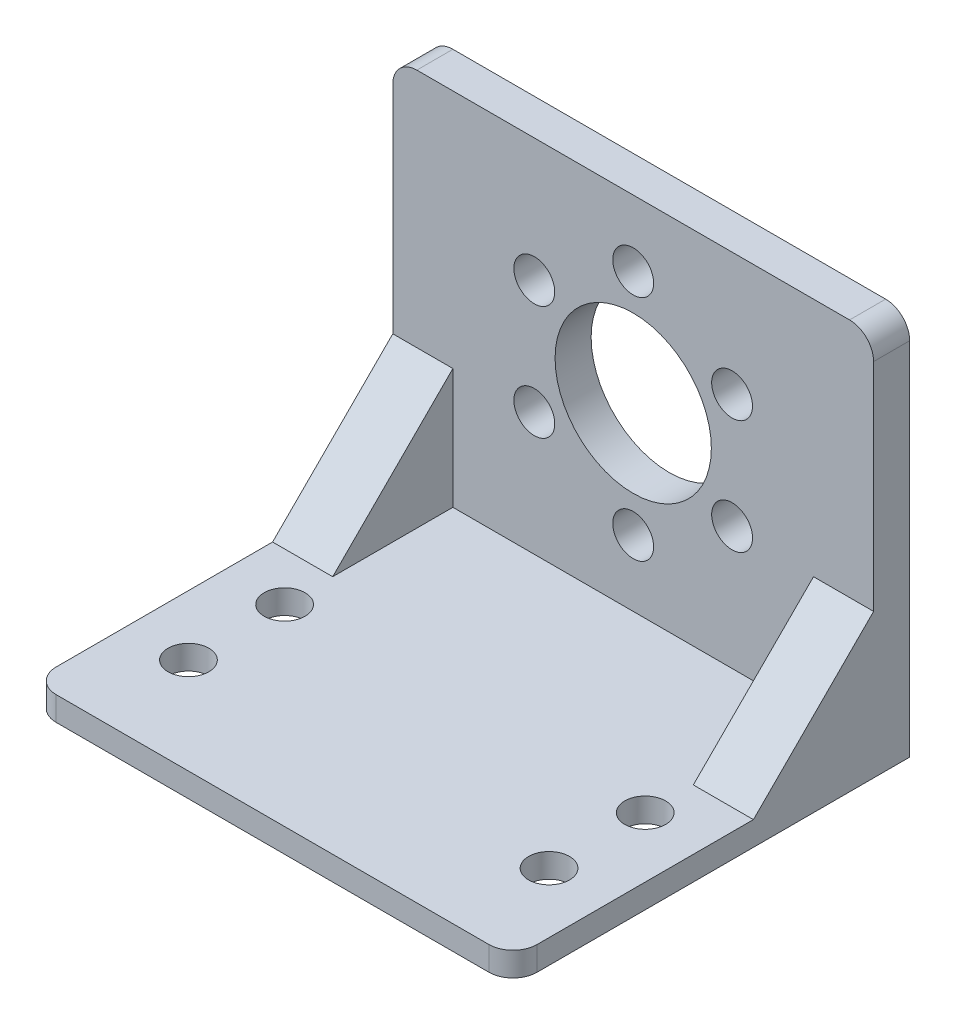
ISO-10303-21;
HEADER;
FILE_DESCRIPTION(('STEP AP214'),'2;1');
FILE_NAME('part.step','',(''),(''),'','','');
FILE_SCHEMA(('AUTOMOTIVE_DESIGN { 1 0 10303 214 1 1 1 1 }'));
ENDSEC;
DATA;
#1=APPLICATION_CONTEXT('core data for automotive mechanical design processes');
#2=APPLICATION_PROTOCOL_DEFINITION('international standard','automotive_design',2000,#1);
#3=PRODUCT_CONTEXT('',#1,'mechanical');
#4=PRODUCT('Part','Part','',(#3));
#5=PRODUCT_RELATED_PRODUCT_CATEGORY('part','',(#4));
#6=PRODUCT_DEFINITION_FORMATION('','',#4);
#7=PRODUCT_DEFINITION_CONTEXT('part definition',#1,'design');
#8=PRODUCT_DEFINITION('design','',#6,#7);
#9=PRODUCT_DEFINITION_SHAPE('','',#8);
#10=(LENGTH_UNIT() NAMED_UNIT(*) SI_UNIT(.MILLI.,.METRE.));
#11=(NAMED_UNIT(*) PLANE_ANGLE_UNIT() SI_UNIT($,.RADIAN.));
#12=(NAMED_UNIT(*) SI_UNIT($,.STERADIAN.) SOLID_ANGLE_UNIT());
#13=UNCERTAINTY_MEASURE_WITH_UNIT(LENGTH_MEASURE(1.E-05),#10,'distance_accuracy_value','');
#14=(GEOMETRIC_REPRESENTATION_CONTEXT(3) GLOBAL_UNCERTAINTY_ASSIGNED_CONTEXT((#13)) GLOBAL_UNIT_ASSIGNED_CONTEXT((#10,
#11,#12)) REPRESENTATION_CONTEXT('',''));
#15=CARTESIAN_POINT('',(0.,0.,0.));
#16=DIRECTION('',(0.,0.,1.));
#17=DIRECTION('',(1.,0.,0.));
#18=AXIS2_PLACEMENT_3D('',#15,#16,#17);
#19=CARTESIAN_POINT('',(0.,0.,3.));
#20=DIRECTION('',(0.,0.,1.));
#21=DIRECTION('',(1.,0.,0.));
#22=AXIS2_PLACEMENT_3D('',#19,#20,#21);
#23=PLANE('',#22);
#24=CARTESIAN_POINT('',(0.,17.,3.));
#25=DIRECTION('',(0.,0.,1.));
#26=DIRECTION('',(1.,0.,0.));
#27=AXIS2_PLACEMENT_3D('',#24,#25,#26);
#28=CIRCLE('',#27,6.5);
#29=CARTESIAN_POINT('',(6.5,17.,3.));
#30=VERTEX_POINT('',#29);
#31=EDGE_CURVE('E194',#30,#30,#28,.T.);
#32=ORIENTED_EDGE('',*,*,#31,.F.);
#33=EDGE_LOOP('',(#32));
#34=FACE_BOUND('',#33,.T.);
#35=CARTESIAN_POINT('',(-8.22724133595218,12.25,3.));
#36=DIRECTION('',(0.,0.,1.));
#37=DIRECTION('',(1.,0.,0.));
#38=AXIS2_PLACEMENT_3D('',#35,#36,#37);
#39=CIRCLE('',#38,1.7);
#40=CARTESIAN_POINT('',(-6.52724133595218,12.25,3.));
#41=VERTEX_POINT('',#40);
#42=EDGE_CURVE('E207',#41,#41,#39,.T.);
#43=ORIENTED_EDGE('',*,*,#42,.F.);
#44=EDGE_LOOP('',(#43));
#45=FACE_BOUND('',#44,.T.);
#46=CARTESIAN_POINT('',(8.22724133595218,12.25,3.));
#47=DIRECTION('',(0.,0.,1.));
#48=DIRECTION('',(1.,0.,0.));
#49=AXIS2_PLACEMENT_3D('',#46,#47,#48);
#50=CIRCLE('',#49,1.7);
#51=CARTESIAN_POINT('',(9.92724133595218,12.25,3.));
#52=VERTEX_POINT('',#51);
#53=EDGE_CURVE('E219',#52,#52,#50,.T.);
#54=ORIENTED_EDGE('',*,*,#53,.F.);
#55=EDGE_LOOP('',(#54));
#56=FACE_BOUND('',#55,.T.);
#57=CARTESIAN_POINT('',(0.,26.5,3.));
#58=DIRECTION('',(0.,0.,1.));
#59=DIRECTION('',(1.,0.,0.));
#60=AXIS2_PLACEMENT_3D('',#57,#58,#59);
#61=CIRCLE('',#60,1.7);
#62=CARTESIAN_POINT('',(1.7,26.5,3.));
#63=VERTEX_POINT('',#62);
#64=EDGE_CURVE('E231',#63,#63,#61,.T.);
#65=ORIENTED_EDGE('',*,*,#64,.F.);
#66=EDGE_LOOP('',(#65));
#67=FACE_BOUND('',#66,.T.);
#68=CARTESIAN_POINT('',(8.22724133595218,21.75,3.));
#69=DIRECTION('',(0.,0.,1.));
#70=DIRECTION('',(1.,0.,0.));
#71=AXIS2_PLACEMENT_3D('',#68,#69,#70);
#72=CIRCLE('',#71,1.7);
#73=CARTESIAN_POINT('',(9.92724133595218,21.75,3.));
#74=VERTEX_POINT('',#73);
#75=EDGE_CURVE('E225',#74,#74,#72,.T.);
#76=ORIENTED_EDGE('',*,*,#75,.F.);
#77=EDGE_LOOP('',(#76));
#78=FACE_BOUND('',#77,.T.);
#79=CARTESIAN_POINT('',(0.,7.49999999999999,3.));
#80=DIRECTION('',(0.,0.,1.));
#81=DIRECTION('',(1.,0.,0.));
#82=AXIS2_PLACEMENT_3D('',#79,#80,#81);
#83=CIRCLE('',#82,1.7);
#84=CARTESIAN_POINT('',(1.7,7.49999999999999,3.));
#85=VERTEX_POINT('',#84);
#86=EDGE_CURVE('E213',#85,#85,#83,.T.);
#87=ORIENTED_EDGE('',*,*,#86,.F.);
#88=EDGE_LOOP('',(#87));
#89=FACE_BOUND('',#88,.T.);
#90=CARTESIAN_POINT('',(-8.22724133595218,21.75,3.));
#91=DIRECTION('',(0.,0.,1.));
#92=DIRECTION('',(1.,0.,0.));
#93=AXIS2_PLACEMENT_3D('',#90,#91,#92);
#94=CIRCLE('',#93,1.7);
#95=CARTESIAN_POINT('',(-6.52724133595218,21.75,3.));
#96=VERTEX_POINT('',#95);
#97=EDGE_CURVE('E201',#96,#96,#94,.T.);
#98=ORIENTED_EDGE('',*,*,#97,.F.);
#99=EDGE_LOOP('',(#98));
#100=FACE_BOUND('',#99,.T.);
#101=DIRECTION('',(-1.,0.,0.));
#102=VECTOR('',#101,1.);
#103=CARTESIAN_POINT('',(20.,32.,3.));
#104=LINE('',#103,#102);
#105=CARTESIAN_POINT('',(18.,32.,3.));
#106=VERTEX_POINT('',#105);
#107=CARTESIAN_POINT('',(-18.,32.,3.));
#108=VERTEX_POINT('',#107);
#109=EDGE_CURVE('E239',#106,#108,#104,.T.);
#110=ORIENTED_EDGE('',*,*,#109,.T.);
#111=CARTESIAN_POINT('',(-18.,30.,3.));
#112=DIRECTION('',(0.,0.,1.));
#113=DIRECTION('',(1.,0.,0.));
#114=AXIS2_PLACEMENT_3D('',#111,#112,#113);
#115=CIRCLE('',#114,2.);
#116=CARTESIAN_POINT('',(-20.,30.,3.));
#117=VERTEX_POINT('',#116);
#118=EDGE_CURVE('E11',#108,#117,#115,.T.);
#119=ORIENTED_EDGE('',*,*,#118,.T.);
#120=DIRECTION('',(0.,-1.,0.));
#121=VECTOR('',#120,1.);
#122=CARTESIAN_POINT('',(-20.,0.,3.));
#123=LINE('',#122,#121);
#124=CARTESIAN_POINT('',(-20.,12.,3.));
#125=VERTEX_POINT('',#124);
#126=EDGE_CURVE('E242',#117,#125,#123,.T.);
#127=ORIENTED_EDGE('',*,*,#126,.T.);
#128=DIRECTION('',(-1.,0.,0.));
#129=VECTOR('',#128,1.);
#130=CARTESIAN_POINT('',(-15.,12.,3.));
#131=LINE('',#130,#129);
#132=CARTESIAN_POINT('',(-15.,12.,3.));
#133=VERTEX_POINT('',#132);
#134=EDGE_CURVE('E161',#133,#125,#131,.T.);
#135=ORIENTED_EDGE('',*,*,#134,.F.);
#136=DIRECTION('',(0.,-1.,0.));
#137=VECTOR('',#136,1.);
#138=CARTESIAN_POINT('',(-15.,1.99999999999999,3.));
#139=LINE('',#138,#137);
#140=CARTESIAN_POINT('',(-15.,1.99999999999999,3.));
#141=VERTEX_POINT('',#140);
#142=EDGE_CURVE('E166',#133,#141,#139,.T.);
#143=ORIENTED_EDGE('',*,*,#142,.T.);
#144=DIRECTION('',(-1.,0.,0.));
#145=VECTOR('',#144,1.);
#146=CARTESIAN_POINT('',(-20.,1.99999999999999,3.));
#147=LINE('',#146,#145);
#148=CARTESIAN_POINT('',(15.,2.,3.));
#149=VERTEX_POINT('',#148);
#150=EDGE_CURVE('E150',#149,#141,#147,.T.);
#151=ORIENTED_EDGE('',*,*,#150,.F.);
#152=DIRECTION('',(0.,-1.,0.));
#153=VECTOR('',#152,1.);
#154=CARTESIAN_POINT('',(15.,1.99999999999999,3.));
#155=LINE('',#154,#153);
#156=CARTESIAN_POINT('',(15.,12.,3.));
#157=VERTEX_POINT('',#156);
#158=EDGE_CURVE('E304',#157,#149,#155,.T.);
#159=ORIENTED_EDGE('',*,*,#158,.F.);
#160=DIRECTION('',(1.,0.,0.));
#161=VECTOR('',#160,1.);
#162=CARTESIAN_POINT('',(15.,12.,3.));
#163=LINE('',#162,#161);
#164=CARTESIAN_POINT('',(20.,12.,3.));
#165=VERTEX_POINT('',#164);
#166=EDGE_CURVE('E178',#157,#165,#163,.T.);
#167=ORIENTED_EDGE('',*,*,#166,.T.);
#168=DIRECTION('',(0.,1.,0.));
#169=VECTOR('',#168,1.);
#170=CARTESIAN_POINT('',(20.,0.,3.));
#171=LINE('',#170,#169);
#172=CARTESIAN_POINT('',(20.,30.,3.));
#173=VERTEX_POINT('',#172);
#174=EDGE_CURVE('E237',#165,#173,#171,.T.);
#175=ORIENTED_EDGE('',*,*,#174,.T.);
#176=CARTESIAN_POINT('',(18.,30.,3.));
#177=DIRECTION('',(0.,0.,1.));
#178=DIRECTION('',(1.,0.,0.));
#179=AXIS2_PLACEMENT_3D('',#176,#177,#178);
#180=CIRCLE('',#179,2.);
#181=EDGE_CURVE('E56',#173,#106,#180,.T.);
#182=ORIENTED_EDGE('',*,*,#181,.T.);
#183=EDGE_LOOP('',(#110,#119,#127,#135,#143,#151,#159,#167,#175,#182));
#184=FACE_BOUND('',#183,.T.);
#185=ADVANCED_FACE('F47',(#34,#45,#56,#67,#78,#89,#100,#184),#23,.T.);
#186=CARTESIAN_POINT('',(-20.,1.99999999999999,33.));
#187=DIRECTION('',(0.,-1.,0.));
#188=DIRECTION('',(1.,0.,0.));
#189=AXIS2_PLACEMENT_3D('',#186,#187,#188);
#190=PLANE('',#189);
#191=CARTESIAN_POINT('',(15.,2.,17.));
#192=DIRECTION('',(0.,1.,0.));
#193=DIRECTION('',(0.,0.,1.));
#194=AXIS2_PLACEMENT_3D('',#191,#192,#193);
#195=CIRCLE('',#194,1.7);
#196=CARTESIAN_POINT('',(15.,2.,18.7));
#197=VERTEX_POINT('',#196);
#198=EDGE_CURVE('E321',#197,#197,#195,.T.);
#199=ORIENTED_EDGE('',*,*,#198,.F.);
#200=EDGE_LOOP('',(#199));
#201=FACE_BOUND('',#200,.T.);
#202=CARTESIAN_POINT('',(-15.,2.,25.));
#203=DIRECTION('',(0.,1.,0.));
#204=DIRECTION('',(0.,0.,1.));
#205=AXIS2_PLACEMENT_3D('',#202,#203,#204);
#206=CIRCLE('',#205,1.7);
#207=CARTESIAN_POINT('',(-15.,2.,26.7));
#208=VERTEX_POINT('',#207);
#209=EDGE_CURVE('E322',#208,#208,#206,.T.);
#210=ORIENTED_EDGE('',*,*,#209,.F.);
#211=EDGE_LOOP('',(#210));
#212=FACE_BOUND('',#211,.T.);
#213=CARTESIAN_POINT('',(15.,2.,25.));
#214=DIRECTION('',(0.,1.,0.));
#215=DIRECTION('',(0.,0.,1.));
#216=AXIS2_PLACEMENT_3D('',#213,#214,#215);
#217=CIRCLE('',#216,1.7);
#218=CARTESIAN_POINT('',(15.,2.,26.7));
#219=VERTEX_POINT('',#218);
#220=EDGE_CURVE('E325',#219,#219,#217,.T.);
#221=ORIENTED_EDGE('',*,*,#220,.F.);
#222=EDGE_LOOP('',(#221));
#223=FACE_BOUND('',#222,.T.);
#224=CARTESIAN_POINT('',(-15.,2.,17.));
#225=DIRECTION('',(0.,1.,0.));
#226=DIRECTION('',(0.,0.,1.));
#227=AXIS2_PLACEMENT_3D('',#224,#225,#226);
#228=CIRCLE('',#227,1.7);
#229=CARTESIAN_POINT('',(-15.,2.,18.7));
#230=VERTEX_POINT('',#229);
#231=EDGE_CURVE('E293',#230,#230,#228,.T.);
#232=ORIENTED_EDGE('',*,*,#231,.F.);
#233=EDGE_LOOP('',(#232));
#234=FACE_BOUND('',#233,.T.);
#235=DIRECTION('',(-1.,0.,0.));
#236=VECTOR('',#235,1.);
#237=CARTESIAN_POINT('',(-20.,1.99999999999999,33.));
#238=LINE('',#237,#236);
#239=CARTESIAN_POINT('',(18.,2.,33.));
#240=VERTEX_POINT('',#239);
#241=CARTESIAN_POINT('',(-18.,1.99999999999999,33.));
#242=VERTEX_POINT('',#241);
#243=EDGE_CURVE('E187',#240,#242,#238,.T.);
#244=ORIENTED_EDGE('',*,*,#243,.F.);
#245=CARTESIAN_POINT('',(18.,2.,31.));
#246=DIRECTION('',(0.,-1.,0.));
#247=DIRECTION('',(1.,0.,0.));
#248=AXIS2_PLACEMENT_3D('',#245,#246,#247);
#249=CIRCLE('',#248,2.);
#250=CARTESIAN_POINT('',(20.,2.,31.));
#251=VERTEX_POINT('',#250);
#252=EDGE_CURVE('E265',#240,#251,#249,.F.);
#253=ORIENTED_EDGE('',*,*,#252,.T.);
#254=DIRECTION('',(0.,0.,-1.));
#255=VECTOR('',#254,1.);
#256=CARTESIAN_POINT('',(20.,2.,33.));
#257=LINE('',#256,#255);
#258=CARTESIAN_POINT('',(20.,2.,13.));
#259=VERTEX_POINT('',#258);
#260=EDGE_CURVE('E192',#251,#259,#257,.T.);
#261=ORIENTED_EDGE('',*,*,#260,.T.);
#262=DIRECTION('',(1.,0.,0.));
#263=VECTOR('',#262,1.);
#264=CARTESIAN_POINT('',(15.,2.,13.));
#265=LINE('',#264,#263);
#266=CARTESIAN_POINT('',(15.,2.,13.));
#267=VERTEX_POINT('',#266);
#268=EDGE_CURVE('E175',#267,#259,#265,.T.);
#269=ORIENTED_EDGE('',*,*,#268,.F.);
#270=DIRECTION('',(0.,0.,1.));
#271=VECTOR('',#270,1.);
#272=CARTESIAN_POINT('',(15.,2.,13.));
#273=LINE('',#272,#271);
#274=EDGE_CURVE('E157',#149,#267,#273,.T.);
#275=ORIENTED_EDGE('',*,*,#274,.F.);
#276=ORIENTED_EDGE('',*,*,#150,.T.);
#277=DIRECTION('',(0.,0.,1.));
#278=VECTOR('',#277,1.);
#279=CARTESIAN_POINT('',(-15.,2.,13.));
#280=LINE('',#279,#278);
#281=CARTESIAN_POINT('',(-15.,2.,13.));
#282=VERTEX_POINT('',#281);
#283=EDGE_CURVE('E155',#141,#282,#280,.T.);
#284=ORIENTED_EDGE('',*,*,#283,.T.);
#285=DIRECTION('',(-1.,0.,0.));
#286=VECTOR('',#285,1.);
#287=CARTESIAN_POINT('',(-15.,2.,13.));
#288=LINE('',#287,#286);
#289=CARTESIAN_POINT('',(-20.,2.,13.));
#290=VERTEX_POINT('',#289);
#291=EDGE_CURVE('E181',#282,#290,#288,.T.);
#292=ORIENTED_EDGE('',*,*,#291,.T.);
#293=DIRECTION('',(0.,0.,-1.));
#294=VECTOR('',#293,1.);
#295=CARTESIAN_POINT('',(-20.,1.99999999999999,33.));
#296=LINE('',#295,#294);
#297=CARTESIAN_POINT('',(-20.,1.99999999999999,31.));
#298=VERTEX_POINT('',#297);
#299=EDGE_CURVE('E189',#298,#290,#296,.T.);
#300=ORIENTED_EDGE('',*,*,#299,.F.);
#301=CARTESIAN_POINT('',(-18.,1.99999999999999,31.));
#302=DIRECTION('',(0.,-1.,0.));
#303=DIRECTION('',(1.,0.,0.));
#304=AXIS2_PLACEMENT_3D('',#301,#302,#303);
#305=CIRCLE('',#304,2.);
#306=EDGE_CURVE('E263',#298,#242,#305,.F.);
#307=ORIENTED_EDGE('',*,*,#306,.T.);
#308=EDGE_LOOP('',(#244,#253,#261,#269,#275,#276,#284,#292,#300,#307));
#309=FACE_BOUND('',#308,.T.);
#310=ADVANCED_FACE('F153',(#201,#212,#223,#234,#309),#190,.F.);
#311=CARTESIAN_POINT('',(0.,0.,0.));
#312=DIRECTION('',(0.,0.,1.));
#313=DIRECTION('',(1.,0.,0.));
#314=AXIS2_PLACEMENT_3D('',#311,#312,#313);
#315=PLANE('',#314);
#316=CARTESIAN_POINT('',(0.,17.,0.));
#317=DIRECTION('',(0.,0.,1.));
#318=DIRECTION('',(1.,0.,0.));
#319=AXIS2_PLACEMENT_3D('',#316,#317,#318);
#320=CIRCLE('',#319,6.5);
#321=CARTESIAN_POINT('',(6.5,17.,0.));
#322=VERTEX_POINT('',#321);
#323=EDGE_CURVE('E197',#322,#322,#320,.F.);
#324=ORIENTED_EDGE('',*,*,#323,.F.);
#325=EDGE_LOOP('',(#324));
#326=FACE_BOUND('',#325,.T.);
#327=DIRECTION('',(0.,-1.,0.));
#328=VECTOR('',#327,1.);
#329=CARTESIAN_POINT('',(-20.,0.,0.));
#330=LINE('',#329,#328);
#331=CARTESIAN_POINT('',(-20.,30.,0.));
#332=VERTEX_POINT('',#331);
#333=CARTESIAN_POINT('',(-20.,0.,0.));
#334=VERTEX_POINT('',#333);
#335=EDGE_CURVE('E249',#332,#334,#330,.T.);
#336=ORIENTED_EDGE('',*,*,#335,.F.);
#337=CARTESIAN_POINT('',(-18.,30.,0.));
#338=DIRECTION('',(0.,0.,1.));
#339=DIRECTION('',(1.,0.,0.));
#340=AXIS2_PLACEMENT_3D('',#337,#338,#339);
#341=CIRCLE('',#340,2.);
#342=CARTESIAN_POINT('',(-18.,32.,0.));
#343=VERTEX_POINT('',#342);
#344=EDGE_CURVE('E282',#332,#343,#341,.F.);
#345=ORIENTED_EDGE('',*,*,#344,.T.);
#346=DIRECTION('',(-1.,0.,0.));
#347=VECTOR('',#346,1.);
#348=CARTESIAN_POINT('',(20.,32.,0.));
#349=LINE('',#348,#347);
#350=CARTESIAN_POINT('',(18.,32.,0.));
#351=VERTEX_POINT('',#350);
#352=EDGE_CURVE('E247',#351,#343,#349,.T.);
#353=ORIENTED_EDGE('',*,*,#352,.F.);
#354=CARTESIAN_POINT('',(18.,30.,0.));
#355=DIRECTION('',(0.,0.,1.));
#356=DIRECTION('',(1.,0.,0.));
#357=AXIS2_PLACEMENT_3D('',#354,#355,#356);
#358=CIRCLE('',#357,2.);
#359=CARTESIAN_POINT('',(20.,30.,0.));
#360=VERTEX_POINT('',#359);
#361=EDGE_CURVE('E280',#351,#360,#358,.F.);
#362=ORIENTED_EDGE('',*,*,#361,.T.);
#363=DIRECTION('',(0.,1.,0.));
#364=VECTOR('',#363,1.);
#365=CARTESIAN_POINT('',(20.,0.,0.));
#366=LINE('',#365,#364);
#367=CARTESIAN_POINT('',(20.,0.,0.));
#368=VERTEX_POINT('',#367);
#369=EDGE_CURVE('E234',#368,#360,#366,.T.);
#370=ORIENTED_EDGE('',*,*,#369,.F.);
#371=DIRECTION('',(1.,0.,0.));
#372=VECTOR('',#371,1.);
#373=CARTESIAN_POINT('',(20.,0.,0.));
#374=LINE('',#373,#372);
#375=EDGE_CURVE('E240',#334,#368,#374,.T.);
#376=ORIENTED_EDGE('',*,*,#375,.F.);
#377=EDGE_LOOP('',(#336,#345,#353,#362,#370,#376));
#378=FACE_BOUND('',#377,.T.);
#379=CARTESIAN_POINT('',(0.,26.5,0.));
#380=DIRECTION('',(0.,0.,1.));
#381=DIRECTION('',(1.,0.,0.));
#382=AXIS2_PLACEMENT_3D('',#379,#380,#381);
#383=CIRCLE('',#382,1.7);
#384=CARTESIAN_POINT('',(1.7,26.5,0.));
#385=VERTEX_POINT('',#384);
#386=EDGE_CURVE('E228',#385,#385,#383,.T.);
#387=ORIENTED_EDGE('',*,*,#386,.T.);
#388=EDGE_LOOP('',(#387));
#389=FACE_BOUND('',#388,.T.);
#390=CARTESIAN_POINT('',(8.22724133595218,21.75,0.));
#391=DIRECTION('',(0.,0.,1.));
#392=DIRECTION('',(1.,0.,0.));
#393=AXIS2_PLACEMENT_3D('',#390,#391,#392);
#394=CIRCLE('',#393,1.7);
#395=CARTESIAN_POINT('',(9.92724133595218,21.75,0.));
#396=VERTEX_POINT('',#395);
#397=EDGE_CURVE('E222',#396,#396,#394,.T.);
#398=ORIENTED_EDGE('',*,*,#397,.T.);
#399=EDGE_LOOP('',(#398));
#400=FACE_BOUND('',#399,.T.);
#401=CARTESIAN_POINT('',(8.22724133595218,12.25,0.));
#402=DIRECTION('',(0.,0.,1.));
#403=DIRECTION('',(1.,0.,0.));
#404=AXIS2_PLACEMENT_3D('',#401,#402,#403);
#405=CIRCLE('',#404,1.7);
#406=CARTESIAN_POINT('',(9.92724133595218,12.25,0.));
#407=VERTEX_POINT('',#406);
#408=EDGE_CURVE('E216',#407,#407,#405,.T.);
#409=ORIENTED_EDGE('',*,*,#408,.T.);
#410=EDGE_LOOP('',(#409));
#411=FACE_BOUND('',#410,.T.);
#412=CARTESIAN_POINT('',(0.,7.49999999999999,0.));
#413=DIRECTION('',(0.,0.,1.));
#414=DIRECTION('',(1.,0.,0.));
#415=AXIS2_PLACEMENT_3D('',#412,#413,#414);
#416=CIRCLE('',#415,1.7);
#417=CARTESIAN_POINT('',(1.7,7.49999999999999,0.));
#418=VERTEX_POINT('',#417);
#419=EDGE_CURVE('E210',#418,#418,#416,.T.);
#420=ORIENTED_EDGE('',*,*,#419,.T.);
#421=EDGE_LOOP('',(#420));
#422=FACE_BOUND('',#421,.T.);
#423=CARTESIAN_POINT('',(-8.22724133595218,12.25,0.));
#424=DIRECTION('',(0.,0.,1.));
#425=DIRECTION('',(1.,0.,0.));
#426=AXIS2_PLACEMENT_3D('',#423,#424,#425);
#427=CIRCLE('',#426,1.7);
#428=CARTESIAN_POINT('',(-6.52724133595218,12.25,0.));
#429=VERTEX_POINT('',#428);
#430=EDGE_CURVE('E204',#429,#429,#427,.T.);
#431=ORIENTED_EDGE('',*,*,#430,.T.);
#432=EDGE_LOOP('',(#431));
#433=FACE_BOUND('',#432,.T.);
#434=CARTESIAN_POINT('',(-8.22724133595218,21.75,0.));
#435=DIRECTION('',(0.,0.,1.));
#436=DIRECTION('',(1.,0.,0.));
#437=AXIS2_PLACEMENT_3D('',#434,#435,#436);
#438=CIRCLE('',#437,1.7);
#439=CARTESIAN_POINT('',(-6.52724133595218,21.75,0.));
#440=VERTEX_POINT('',#439);
#441=EDGE_CURVE('E200',#440,#440,#438,.T.);
#442=ORIENTED_EDGE('',*,*,#441,.T.);
#443=EDGE_LOOP('',(#442));
#444=FACE_BOUND('',#443,.T.);
#445=ADVANCED_FACE('F336',(#326,#378,#389,#400,#411,#422,#433,#444),#315,.F.);
#446=CARTESIAN_POINT('',(20.,0.,3.));
#447=DIRECTION('',(-1.,0.,0.));
#448=DIRECTION('',(0.,0.,1.));
#449=AXIS2_PLACEMENT_3D('',#446,#447,#448);
#450=PLANE('',#449);
#451=ORIENTED_EDGE('',*,*,#260,.F.);
#452=DIRECTION('',(0.,1.,0.));
#453=VECTOR('',#452,1.);
#454=CARTESIAN_POINT('',(20.,0.,31.));
#455=LINE('',#454,#453);
#456=CARTESIAN_POINT('',(20.,0.,31.));
#457=VERTEX_POINT('',#456);
#458=EDGE_CURVE('E269',#251,#457,#455,.F.);
#459=ORIENTED_EDGE('',*,*,#458,.T.);
#460=DIRECTION('',(0.,0.,-1.));
#461=VECTOR('',#460,1.);
#462=CARTESIAN_POINT('',(20.,0.,3.));
#463=LINE('',#462,#461);
#464=EDGE_CURVE('E244',#457,#368,#463,.T.);
#465=ORIENTED_EDGE('',*,*,#464,.T.);
#466=ORIENTED_EDGE('',*,*,#369,.T.);
#467=DIRECTION('',(0.,0.,-1.));
#468=VECTOR('',#467,1.);
#469=CARTESIAN_POINT('',(20.,30.,3.));
#470=LINE('',#469,#468);
#471=EDGE_CURVE('E267',#360,#173,#470,.F.);
#472=ORIENTED_EDGE('',*,*,#471,.T.);
#473=ORIENTED_EDGE('',*,*,#174,.F.);
#474=DIRECTION('',(0.,0.707106781186547,-0.707106781186548));
#475=VECTOR('',#474,1.);
#476=CARTESIAN_POINT('',(20.,12.,3.));
#477=LINE('',#476,#475);
#478=EDGE_CURVE('E300',#259,#165,#477,.T.);
#479=ORIENTED_EDGE('',*,*,#478,.F.);
#480=EDGE_LOOP('',(#451,#459,#465,#466,#472,#473,#479));
#481=FACE_BOUND('',#480,.T.);
#482=ADVANCED_FACE('F381',(#481),#450,.F.);
#483=CARTESIAN_POINT('',(20.,32.,3.));
#484=DIRECTION('',(0.,-1.,0.));
#485=DIRECTION('',(0.,0.,-1.));
#486=AXIS2_PLACEMENT_3D('',#483,#484,#485);
#487=PLANE('',#486);
#488=ORIENTED_EDGE('',*,*,#352,.T.);
#489=DIRECTION('',(0.,0.,-1.));
#490=VECTOR('',#489,1.);
#491=CARTESIAN_POINT('',(-18.,32.,3.));
#492=LINE('',#491,#490);
#493=EDGE_CURVE('E64',#343,#108,#492,.F.);
#494=ORIENTED_EDGE('',*,*,#493,.T.);
#495=ORIENTED_EDGE('',*,*,#109,.F.);
#496=DIRECTION('',(0.,0.,-1.));
#497=VECTOR('',#496,1.);
#498=CARTESIAN_POINT('',(18.,32.,3.));
#499=LINE('',#498,#497);
#500=EDGE_CURVE('E284',#106,#351,#499,.T.);
#501=ORIENTED_EDGE('',*,*,#500,.T.);
#502=EDGE_LOOP('',(#488,#494,#495,#501));
#503=FACE_BOUND('',#502,.T.);
#504=ADVANCED_FACE('F384',(#503),#487,.F.);
#505=CARTESIAN_POINT('',(-20.,0.,3.));
#506=DIRECTION('',(1.,0.,0.));
#507=DIRECTION('',(0.,0.,-1.));
#508=AXIS2_PLACEMENT_3D('',#505,#506,#507);
#509=PLANE('',#508);
#510=DIRECTION('',(0.,0.,-1.));
#511=VECTOR('',#510,1.);
#512=CARTESIAN_POINT('',(-20.,0.,3.));
#513=LINE('',#512,#511);
#514=CARTESIAN_POINT('',(-20.,0.,31.));
#515=VERTEX_POINT('',#514);
#516=EDGE_CURVE('E254',#515,#334,#513,.T.);
#517=ORIENTED_EDGE('',*,*,#516,.F.);
#518=DIRECTION('',(0.,-1.,0.));
#519=VECTOR('',#518,1.);
#520=CARTESIAN_POINT('',(-20.,1.99999999999999,31.));
#521=LINE('',#520,#519);
#522=EDGE_CURVE('E278',#515,#298,#521,.F.);
#523=ORIENTED_EDGE('',*,*,#522,.T.);
#524=ORIENTED_EDGE('',*,*,#299,.T.);
#525=DIRECTION('',(0.,0.707106781186547,-0.707106781186548));
#526=VECTOR('',#525,1.);
#527=CARTESIAN_POINT('',(-20.,12.,3.));
#528=LINE('',#527,#526);
#529=EDGE_CURVE('E172',#290,#125,#528,.T.);
#530=ORIENTED_EDGE('',*,*,#529,.T.);
#531=ORIENTED_EDGE('',*,*,#126,.F.);
#532=DIRECTION('',(0.,0.,-1.));
#533=VECTOR('',#532,1.);
#534=CARTESIAN_POINT('',(-20.,30.,3.));
#535=LINE('',#534,#533);
#536=EDGE_CURVE('E275',#117,#332,#535,.T.);
#537=ORIENTED_EDGE('',*,*,#536,.T.);
#538=ORIENTED_EDGE('',*,*,#335,.T.);
#539=EDGE_LOOP('',(#517,#523,#524,#530,#531,#537,#538));
#540=FACE_BOUND('',#539,.T.);
#541=ADVANCED_FACE('F351',(#540),#509,.F.);
#542=CARTESIAN_POINT('',(20.,0.,3.));
#543=DIRECTION('',(0.,1.,0.));
#544=DIRECTION('',(-1.,0.,0.));
#545=AXIS2_PLACEMENT_3D('',#542,#543,#544);
#546=PLANE('',#545);
#547=CARTESIAN_POINT('',(15.,0.,17.));
#548=DIRECTION('',(0.,1.,0.));
#549=DIRECTION('',(-1.,0.,0.));
#550=AXIS2_PLACEMENT_3D('',#547,#548,#549);
#551=CIRCLE('',#550,1.7);
#552=CARTESIAN_POINT('',(13.3,0.,17.));
#553=VERTEX_POINT('',#552);
#554=EDGE_CURVE('E51',#553,#553,#551,.T.);
#555=ORIENTED_EDGE('',*,*,#554,.T.);
#556=EDGE_LOOP('',(#555));
#557=FACE_BOUND('',#556,.T.);
#558=CARTESIAN_POINT('',(-15.,0.,25.));
#559=DIRECTION('',(0.,1.,0.));
#560=DIRECTION('',(-1.,0.,0.));
#561=AXIS2_PLACEMENT_3D('',#558,#559,#560);
#562=CIRCLE('',#561,1.7);
#563=CARTESIAN_POINT('',(-16.7,0.,25.));
#564=VERTEX_POINT('',#563);
#565=EDGE_CURVE('E295',#564,#564,#562,.T.);
#566=ORIENTED_EDGE('',*,*,#565,.T.);
#567=EDGE_LOOP('',(#566));
#568=FACE_BOUND('',#567,.T.);
#569=CARTESIAN_POINT('',(15.,0.,25.));
#570=DIRECTION('',(0.,1.,0.));
#571=DIRECTION('',(-1.,0.,0.));
#572=AXIS2_PLACEMENT_3D('',#569,#570,#571);
#573=CIRCLE('',#572,1.7);
#574=CARTESIAN_POINT('',(13.3,0.,25.));
#575=VERTEX_POINT('',#574);
#576=EDGE_CURVE('E292',#575,#575,#573,.T.);
#577=ORIENTED_EDGE('',*,*,#576,.T.);
#578=EDGE_LOOP('',(#577));
#579=FACE_BOUND('',#578,.T.);
#580=CARTESIAN_POINT('',(-15.,0.,17.));
#581=DIRECTION('',(0.,1.,0.));
#582=DIRECTION('',(-1.,0.,0.));
#583=AXIS2_PLACEMENT_3D('',#580,#581,#582);
#584=CIRCLE('',#583,1.7);
#585=CARTESIAN_POINT('',(-16.7,0.,17.));
#586=VERTEX_POINT('',#585);
#587=EDGE_CURVE('E289',#586,#586,#584,.T.);
#588=ORIENTED_EDGE('',*,*,#587,.T.);
#589=EDGE_LOOP('',(#588));
#590=FACE_BOUND('',#589,.T.);
#591=ORIENTED_EDGE('',*,*,#464,.F.);
#592=CARTESIAN_POINT('',(18.,0.,31.));
#593=DIRECTION('',(0.,1.,0.));
#594=DIRECTION('',(-1.,0.,0.));
#595=AXIS2_PLACEMENT_3D('',#592,#593,#594);
#596=CIRCLE('',#595,2.);
#597=CARTESIAN_POINT('',(18.,0.,33.));
#598=VERTEX_POINT('',#597);
#599=EDGE_CURVE('E273',#457,#598,#596,.F.);
#600=ORIENTED_EDGE('',*,*,#599,.T.);
#601=DIRECTION('',(1.,0.,0.));
#602=VECTOR('',#601,1.);
#603=CARTESIAN_POINT('',(-20.,0.,33.));
#604=LINE('',#603,#602);
#605=CARTESIAN_POINT('',(-18.,0.,33.));
#606=VERTEX_POINT('',#605);
#607=EDGE_CURVE('E160',#606,#598,#604,.T.);
#608=ORIENTED_EDGE('',*,*,#607,.F.);
#609=CARTESIAN_POINT('',(-18.,0.,31.));
#610=DIRECTION('',(0.,1.,0.));
#611=DIRECTION('',(-1.,0.,0.));
#612=AXIS2_PLACEMENT_3D('',#609,#610,#611);
#613=CIRCLE('',#612,2.);
#614=EDGE_CURVE('E271',#606,#515,#613,.F.);
#615=ORIENTED_EDGE('',*,*,#614,.T.);
#616=ORIENTED_EDGE('',*,*,#516,.T.);
#617=ORIENTED_EDGE('',*,*,#375,.T.);
#618=EDGE_LOOP('',(#591,#600,#608,#615,#616,#617));
#619=FACE_BOUND('',#618,.T.);
#620=ADVANCED_FACE('F347',(#557,#568,#579,#590,#619),#546,.F.);
#621=CARTESIAN_POINT('',(0.,26.5,3.));
#622=DIRECTION('',(0.,0.,-1.));
#623=DIRECTION('',(-1.,0.,0.));
#624=AXIS2_PLACEMENT_3D('',#621,#622,#623);
#625=CYLINDRICAL_SURFACE('',#624,1.7);
#626=ORIENTED_EDGE('',*,*,#64,.T.);
#627=EDGE_LOOP('',(#626));
#628=FACE_BOUND('',#627,.T.);
#629=ORIENTED_EDGE('',*,*,#386,.F.);
#630=EDGE_LOOP('',(#629));
#631=FACE_BOUND('',#630,.T.);
#632=ADVANCED_FACE('F350',(#628,#631),#625,.F.);
#633=CARTESIAN_POINT('',(8.22724133595218,21.75,3.));
#634=DIRECTION('',(0.,0.,-1.));
#635=DIRECTION('',(-1.,0.,0.));
#636=AXIS2_PLACEMENT_3D('',#633,#634,#635);
#637=CYLINDRICAL_SURFACE('',#636,1.7);
#638=ORIENTED_EDGE('',*,*,#75,.T.);
#639=EDGE_LOOP('',(#638));
#640=FACE_BOUND('',#639,.T.);
#641=ORIENTED_EDGE('',*,*,#397,.F.);
#642=EDGE_LOOP('',(#641));
#643=FACE_BOUND('',#642,.T.);
#644=ADVANCED_FACE('F452',(#640,#643),#637,.F.);
#645=CARTESIAN_POINT('',(8.22724133595218,12.25,3.));
#646=DIRECTION('',(0.,0.,-1.));
#647=DIRECTION('',(-1.,0.,0.));
#648=AXIS2_PLACEMENT_3D('',#645,#646,#647);
#649=CYLINDRICAL_SURFACE('',#648,1.7);
#650=ORIENTED_EDGE('',*,*,#53,.T.);
#651=EDGE_LOOP('',(#650));
#652=FACE_BOUND('',#651,.T.);
#653=ORIENTED_EDGE('',*,*,#408,.F.);
#654=EDGE_LOOP('',(#653));
#655=FACE_BOUND('',#654,.T.);
#656=ADVANCED_FACE('F449',(#652,#655),#649,.F.);
#657=CARTESIAN_POINT('',(0.,7.49999999999999,3.));
#658=DIRECTION('',(0.,0.,-1.));
#659=DIRECTION('',(-1.,0.,0.));
#660=AXIS2_PLACEMENT_3D('',#657,#658,#659);
#661=CYLINDRICAL_SURFACE('',#660,1.7);
#662=ORIENTED_EDGE('',*,*,#86,.T.);
#663=EDGE_LOOP('',(#662));
#664=FACE_BOUND('',#663,.T.);
#665=ORIENTED_EDGE('',*,*,#419,.F.);
#666=EDGE_LOOP('',(#665));
#667=FACE_BOUND('',#666,.T.);
#668=ADVANCED_FACE('F445',(#664,#667),#661,.F.);
#669=CARTESIAN_POINT('',(-8.22724133595218,12.25,3.));
#670=DIRECTION('',(0.,0.,-1.));
#671=DIRECTION('',(-1.,0.,0.));
#672=AXIS2_PLACEMENT_3D('',#669,#670,#671);
#673=CYLINDRICAL_SURFACE('',#672,1.7);
#674=ORIENTED_EDGE('',*,*,#42,.T.);
#675=EDGE_LOOP('',(#674));
#676=FACE_BOUND('',#675,.T.);
#677=ORIENTED_EDGE('',*,*,#430,.F.);
#678=EDGE_LOOP('',(#677));
#679=FACE_BOUND('',#678,.T.);
#680=ADVANCED_FACE('F441',(#676,#679),#673,.F.);
#681=CARTESIAN_POINT('',(-8.22724133595218,21.75,3.));
#682=DIRECTION('',(0.,0.,-1.));
#683=DIRECTION('',(-1.,0.,0.));
#684=AXIS2_PLACEMENT_3D('',#681,#682,#683);
#685=CYLINDRICAL_SURFACE('',#684,1.7);
#686=ORIENTED_EDGE('',*,*,#97,.T.);
#687=EDGE_LOOP('',(#686));
#688=FACE_BOUND('',#687,.T.);
#689=ORIENTED_EDGE('',*,*,#441,.F.);
#690=EDGE_LOOP('',(#689));
#691=FACE_BOUND('',#690,.T.);
#692=ADVANCED_FACE('F437',(#688,#691),#685,.F.);
#693=CARTESIAN_POINT('',(0.,17.,-0.00100000000000013));
#694=DIRECTION('',(0.,0.,1.));
#695=DIRECTION('',(1.,0.,0.));
#696=AXIS2_PLACEMENT_3D('',#693,#694,#695);
#697=CYLINDRICAL_SURFACE('',#696,6.5);
#698=CARTESIAN_POINT('',(6.5,17.,3.));
#699=CARTESIAN_POINT('',(6.5,17.,2.96875));
#700=CARTESIAN_POINT('',(6.5,17.,2.9375));
#701=CARTESIAN_POINT('',(6.5,17.,2.875));
#702=CARTESIAN_POINT('',(6.5,17.,2.84375));
#703=CARTESIAN_POINT('',(6.5,17.,2.78125));
#704=CARTESIAN_POINT('',(6.5,17.,2.75));
#705=CARTESIAN_POINT('',(6.5,17.,2.6875));
#706=CARTESIAN_POINT('',(6.5,17.,2.65625));
#707=CARTESIAN_POINT('',(6.5,17.,2.59375));
#708=CARTESIAN_POINT('',(6.5,17.,2.5625));
#709=CARTESIAN_POINT('',(6.5,17.,2.5));
#710=CARTESIAN_POINT('',(6.5,17.,2.46875));
#711=CARTESIAN_POINT('',(6.5,17.,2.40625));
#712=CARTESIAN_POINT('',(6.5,17.,2.375));
#713=CARTESIAN_POINT('',(6.5,17.,2.3125));
#714=CARTESIAN_POINT('',(6.5,17.,2.28125));
#715=CARTESIAN_POINT('',(6.5,17.,2.21875));
#716=CARTESIAN_POINT('',(6.5,17.,2.1875));
#717=CARTESIAN_POINT('',(6.5,17.,2.125));
#718=CARTESIAN_POINT('',(6.5,17.,2.09375));
#719=CARTESIAN_POINT('',(6.5,17.,2.03125));
#720=CARTESIAN_POINT('',(6.5,17.,2.));
#721=CARTESIAN_POINT('',(6.5,17.,1.9375));
#722=CARTESIAN_POINT('',(6.5,17.,1.90625));
#723=CARTESIAN_POINT('',(6.5,17.,1.84375));
#724=CARTESIAN_POINT('',(6.5,17.,1.8125));
#725=CARTESIAN_POINT('',(6.5,17.,1.75));
#726=CARTESIAN_POINT('',(6.5,17.,1.71875));
#727=CARTESIAN_POINT('',(6.5,17.,1.65625));
#728=CARTESIAN_POINT('',(6.5,17.,1.625));
#729=CARTESIAN_POINT('',(6.5,17.,1.5625));
#730=CARTESIAN_POINT('',(6.5,17.,1.53125));
#731=CARTESIAN_POINT('',(6.5,17.,1.46875));
#732=CARTESIAN_POINT('',(6.5,17.,1.4375));
#733=CARTESIAN_POINT('',(6.5,17.,1.375));
#734=CARTESIAN_POINT('',(6.5,17.,1.34375));
#735=CARTESIAN_POINT('',(6.5,17.,1.28125));
#736=CARTESIAN_POINT('',(6.5,17.,1.25));
#737=CARTESIAN_POINT('',(6.5,17.,1.1875));
#738=CARTESIAN_POINT('',(6.5,17.,1.15625));
#739=CARTESIAN_POINT('',(6.5,17.,1.09375));
#740=CARTESIAN_POINT('',(6.5,17.,1.0625));
#741=CARTESIAN_POINT('',(6.5,17.,1.));
#742=CARTESIAN_POINT('',(6.5,17.,0.96875));
#743=CARTESIAN_POINT('',(6.5,17.,0.90625));
#744=CARTESIAN_POINT('',(6.5,17.,0.875));
#745=CARTESIAN_POINT('',(6.5,17.,0.8125));
#746=CARTESIAN_POINT('',(6.5,17.,0.78125));
#747=CARTESIAN_POINT('',(6.5,17.,0.71875));
#748=CARTESIAN_POINT('',(6.5,17.,0.6875));
#749=CARTESIAN_POINT('',(6.5,17.,0.625));
#750=CARTESIAN_POINT('',(6.5,17.,0.59375));
#751=CARTESIAN_POINT('',(6.5,17.,0.53125));
#752=CARTESIAN_POINT('',(6.5,17.,0.5));
#753=CARTESIAN_POINT('',(6.5,17.,0.4375));
#754=CARTESIAN_POINT('',(6.5,17.,0.40625));
#755=CARTESIAN_POINT('',(6.5,17.,0.34375));
#756=CARTESIAN_POINT('',(6.5,17.,0.3125));
#757=CARTESIAN_POINT('',(6.5,17.,0.25));
#758=CARTESIAN_POINT('',(6.5,17.,0.21875));
#759=CARTESIAN_POINT('',(6.5,17.,0.15625));
#760=CARTESIAN_POINT('',(6.5,17.,0.125));
#761=CARTESIAN_POINT('',(6.5,17.,0.0625000000000001));
#762=CARTESIAN_POINT('',(6.5,17.,0.0312500000000001));
#763=CARTESIAN_POINT('',(6.5,17.,0.));
#764=B_SPLINE_CURVE_WITH_KNOTS('',3,(#698,#699,#700,#701,#702,#703,#704,#705,#706,#707,#708,
#709,#710,#711,#712,#713,#714,#715,#716,#717,#718,#719,#720,#721,#722,#723,#724,#725,#726,#727,
#728,#729,#730,#731,#732,#733,#734,#735,#736,#737,#738,#739,#740,#741,#742,#743,#744,#745,#746,
#747,#748,#749,#750,#751,#752,#753,#754,#755,#756,#757,#758,#759,#760,#761,#762,#763),
.UNSPECIFIED.,.F.,.F.,(4,2,2,2,2,2,2,2,2,2,2,2,2,2,2,2,2,2,2,2,2,2,2,2,2,2,2,2,2,2,2,2,4),(0.,
0.0937500000000001,0.1875,0.28125,0.375,0.46875,0.5625,0.65625,0.75,0.84375,0.9375,1.03125,
1.125,1.21875,1.3125,1.40625,1.5,1.59375,1.6875,1.78125,1.875,1.96875,2.0625,2.15625,2.25,
2.34375,2.4375,2.53125,2.625,2.71875,2.8125,2.90625,3.),.UNSPECIFIED.);
#765=EDGE_CURVE('BSEAM433',#30,#322,#764,.T.);
#766=ORIENTED_EDGE('',*,*,#31,.T.);
#767=ORIENTED_EDGE('',*,*,#323,.T.);
#768=ORIENTED_EDGE('',*,*,#765,.T.);
#769=ORIENTED_EDGE('',*,*,#765,.F.);
#770=EDGE_LOOP('',(#766,#768,#767,#769));
#771=FACE_BOUND('',#770,.T.);
#772=ADVANCED_FACE('F433',(#771),#697,.F.);
#773=CARTESIAN_POINT('',(0.,0.,33.));
#774=DIRECTION('',(0.,0.,1.));
#775=DIRECTION('',(1.,0.,0.));
#776=AXIS2_PLACEMENT_3D('',#773,#774,#775);
#777=PLANE('',#776);
#778=ORIENTED_EDGE('',*,*,#607,.T.);
#779=DIRECTION('',(0.,1.,0.));
#780=VECTOR('',#779,1.);
#781=CARTESIAN_POINT('',(18.,2.,33.));
#782=LINE('',#781,#780);
#783=EDGE_CURVE('E260',#598,#240,#782,.T.);
#784=ORIENTED_EDGE('',*,*,#783,.T.);
#785=ORIENTED_EDGE('',*,*,#243,.T.);
#786=DIRECTION('',(0.,-1.,0.));
#787=VECTOR('',#786,1.);
#788=CARTESIAN_POINT('',(-18.,0.,33.));
#789=LINE('',#788,#787);
#790=EDGE_CURVE('E257',#242,#606,#789,.T.);
#791=ORIENTED_EDGE('',*,*,#790,.T.);
#792=EDGE_LOOP('',(#778,#784,#785,#791));
#793=FACE_BOUND('',#792,.T.);
#794=ADVANCED_FACE('F364',(#793),#777,.T.);
#795=CARTESIAN_POINT('',(-15.,12.,3.));
#796=DIRECTION('',(0.,0.707106781186548,0.707106781186547));
#797=DIRECTION('',(0.,-0.707106781186547,0.707106781186548));
#798=AXIS2_PLACEMENT_3D('',#795,#796,#797);
#799=PLANE('',#798);
#800=ORIENTED_EDGE('',*,*,#529,.F.);
#801=ORIENTED_EDGE('',*,*,#291,.F.);
#802=DIRECTION('',(0.,0.707106781186547,-0.707106781186548));
#803=VECTOR('',#802,1.);
#804=CARTESIAN_POINT('',(-15.,12.,3.));
#805=LINE('',#804,#803);
#806=EDGE_CURVE('E168',#282,#133,#805,.T.);
#807=ORIENTED_EDGE('',*,*,#806,.T.);
#808=ORIENTED_EDGE('',*,*,#134,.T.);
#809=EDGE_LOOP('',(#800,#801,#807,#808));
#810=FACE_BOUND('',#809,.T.);
#811=ADVANCED_FACE('F429',(#810),#799,.T.);
#812=CARTESIAN_POINT('',(-15.,0.,0.));
#813=DIRECTION('',(-1.,0.,0.));
#814=DIRECTION('',(0.,0.,1.));
#815=AXIS2_PLACEMENT_3D('',#812,#813,#814);
#816=PLANE('',#815);
#817=ORIENTED_EDGE('',*,*,#142,.F.);
#818=ORIENTED_EDGE('',*,*,#806,.F.);
#819=ORIENTED_EDGE('',*,*,#283,.F.);
#820=EDGE_LOOP('',(#817,#818,#819));
#821=FACE_BOUND('',#820,.T.);
#822=ADVANCED_FACE('F165',(#821),#816,.F.);
#823=CARTESIAN_POINT('',(15.,12.,3.));
#824=DIRECTION('',(0.,-0.707106781186548,-0.707106781186547));
#825=DIRECTION('',(0.,0.707106781186547,-0.707106781186548));
#826=AXIS2_PLACEMENT_3D('',#823,#824,#825);
#827=PLANE('',#826);
#828=ORIENTED_EDGE('',*,*,#478,.T.);
#829=ORIENTED_EDGE('',*,*,#166,.F.);
#830=DIRECTION('',(0.,0.707106781186547,-0.707106781186548));
#831=VECTOR('',#830,1.);
#832=CARTESIAN_POINT('',(15.,12.,3.));
#833=LINE('',#832,#831);
#834=EDGE_CURVE('E310',#267,#157,#833,.T.);
#835=ORIENTED_EDGE('',*,*,#834,.F.);
#836=ORIENTED_EDGE('',*,*,#268,.T.);
#837=EDGE_LOOP('',(#828,#829,#835,#836));
#838=FACE_BOUND('',#837,.T.);
#839=ADVANCED_FACE('F419',(#838),#827,.F.);
#840=CARTESIAN_POINT('',(15.,0.,0.));
#841=DIRECTION('',(1.,0.,0.));
#842=DIRECTION('',(0.,0.,1.));
#843=AXIS2_PLACEMENT_3D('',#840,#841,#842);
#844=PLANE('',#843);
#845=ORIENTED_EDGE('',*,*,#158,.T.);
#846=ORIENTED_EDGE('',*,*,#274,.T.);
#847=ORIENTED_EDGE('',*,*,#834,.T.);
#848=EDGE_LOOP('',(#845,#846,#847));
#849=FACE_BOUND('',#848,.T.);
#850=ADVANCED_FACE('F415',(#849),#844,.F.);
#851=CARTESIAN_POINT('',(18.,0.,31.));
#852=DIRECTION('',(0.,-1.,0.));
#853=DIRECTION('',(0.,0.,-1.));
#854=AXIS2_PLACEMENT_3D('',#851,#852,#853);
#855=CYLINDRICAL_SURFACE('',#854,2.);
#856=ORIENTED_EDGE('',*,*,#599,.F.);
#857=ORIENTED_EDGE('',*,*,#458,.F.);
#858=ORIENTED_EDGE('',*,*,#252,.F.);
#859=ORIENTED_EDGE('',*,*,#783,.F.);
#860=EDGE_LOOP('',(#856,#857,#858,#859));
#861=FACE_BOUND('',#860,.T.);
#862=ADVANCED_FACE('F362',(#861),#855,.T.);
#863=CARTESIAN_POINT('',(-18.,0.,31.));
#864=DIRECTION('',(0.,1.,0.));
#865=DIRECTION('',(0.,0.,1.));
#866=AXIS2_PLACEMENT_3D('',#863,#864,#865);
#867=CYLINDRICAL_SURFACE('',#866,2.);
#868=ORIENTED_EDGE('',*,*,#306,.F.);
#869=ORIENTED_EDGE('',*,*,#522,.F.);
#870=ORIENTED_EDGE('',*,*,#614,.F.);
#871=ORIENTED_EDGE('',*,*,#790,.F.);
#872=EDGE_LOOP('',(#868,#869,#870,#871));
#873=FACE_BOUND('',#872,.T.);
#874=ADVANCED_FACE('F371',(#873),#867,.T.);
#875=CARTESIAN_POINT('',(-18.,30.,3.));
#876=DIRECTION('',(0.,0.,-1.));
#877=DIRECTION('',(-1.,0.,0.));
#878=AXIS2_PLACEMENT_3D('',#875,#876,#877);
#879=CYLINDRICAL_SURFACE('',#878,2.);
#880=ORIENTED_EDGE('',*,*,#118,.F.);
#881=ORIENTED_EDGE('',*,*,#493,.F.);
#882=ORIENTED_EDGE('',*,*,#344,.F.);
#883=ORIENTED_EDGE('',*,*,#536,.F.);
#884=EDGE_LOOP('',(#880,#881,#882,#883));
#885=FACE_BOUND('',#884,.T.);
#886=ADVANCED_FACE('F387',(#885),#879,.T.);
#887=CARTESIAN_POINT('',(18.,30.,3.));
#888=DIRECTION('',(0.,0.,-1.));
#889=DIRECTION('',(-1.,0.,0.));
#890=AXIS2_PLACEMENT_3D('',#887,#888,#889);
#891=CYLINDRICAL_SURFACE('',#890,2.);
#892=ORIENTED_EDGE('',*,*,#181,.F.);
#893=ORIENTED_EDGE('',*,*,#471,.F.);
#894=ORIENTED_EDGE('',*,*,#361,.F.);
#895=ORIENTED_EDGE('',*,*,#500,.F.);
#896=EDGE_LOOP('',(#892,#893,#894,#895));
#897=FACE_BOUND('',#896,.T.);
#898=ADVANCED_FACE('F49',(#897),#891,.T.);
#899=CARTESIAN_POINT('',(-15.,-8.00000000000001,17.));
#900=DIRECTION('',(0.,1.,0.));
#901=DIRECTION('',(0.,0.,1.));
#902=AXIS2_PLACEMENT_3D('',#899,#900,#901);
#903=CYLINDRICAL_SURFACE('',#902,1.7);
#904=ORIENTED_EDGE('',*,*,#231,.T.);
#905=EDGE_LOOP('',(#904));
#906=FACE_BOUND('',#905,.T.);
#907=ORIENTED_EDGE('',*,*,#587,.F.);
#908=EDGE_LOOP('',(#907));
#909=FACE_BOUND('',#908,.T.);
#910=ADVANCED_FACE('F341',(#906,#909),#903,.F.);
#911=CARTESIAN_POINT('',(15.,-8.00000000000001,25.));
#912=DIRECTION('',(0.,1.,0.));
#913=DIRECTION('',(0.,0.,1.));
#914=AXIS2_PLACEMENT_3D('',#911,#912,#913);
#915=CYLINDRICAL_SURFACE('',#914,1.7);
#916=ORIENTED_EDGE('',*,*,#220,.T.);
#917=EDGE_LOOP('',(#916));
#918=FACE_BOUND('',#917,.T.);
#919=ORIENTED_EDGE('',*,*,#576,.F.);
#920=EDGE_LOOP('',(#919));
#921=FACE_BOUND('',#920,.T.);
#922=ADVANCED_FACE('F331',(#918,#921),#915,.F.);
#923=CARTESIAN_POINT('',(-15.,-8.00000000000001,25.));
#924=DIRECTION('',(0.,1.,0.));
#925=DIRECTION('',(0.,0.,1.));
#926=AXIS2_PLACEMENT_3D('',#923,#924,#925);
#927=CYLINDRICAL_SURFACE('',#926,1.7);
#928=ORIENTED_EDGE('',*,*,#209,.T.);
#929=EDGE_LOOP('',(#928));
#930=FACE_BOUND('',#929,.T.);
#931=ORIENTED_EDGE('',*,*,#565,.F.);
#932=EDGE_LOOP('',(#931));
#933=FACE_BOUND('',#932,.T.);
#934=ADVANCED_FACE('F657',(#930,#933),#927,.F.);
#935=CARTESIAN_POINT('',(15.,-8.00000000000001,17.));
#936=DIRECTION('',(0.,1.,0.));
#937=DIRECTION('',(0.,0.,1.));
#938=AXIS2_PLACEMENT_3D('',#935,#936,#937);
#939=CYLINDRICAL_SURFACE('',#938,1.7);
#940=ORIENTED_EDGE('',*,*,#198,.T.);
#941=EDGE_LOOP('',(#940));
#942=FACE_BOUND('',#941,.T.);
#943=ORIENTED_EDGE('',*,*,#554,.F.);
#944=EDGE_LOOP('',(#943));
#945=FACE_BOUND('',#944,.T.);
#946=ADVANCED_FACE('F665',(#942,#945),#939,.F.);
#947=CLOSED_SHELL('',(#185,#310,#445,#482,#504,#541,#620,#632,#644,#656,#668,#680,#692,#772,
#794,#811,#822,#839,#850,#862,#874,#886,#898,#910,#922,#934,#946));
#948=MANIFOLD_SOLID_BREP('B2',#947);
#949=ADVANCED_BREP_SHAPE_REPRESENTATION('',(#18,#948),#14);
#950=SHAPE_DEFINITION_REPRESENTATION(#9,#949);
ENDSEC;
END-ISO-10303-21;
